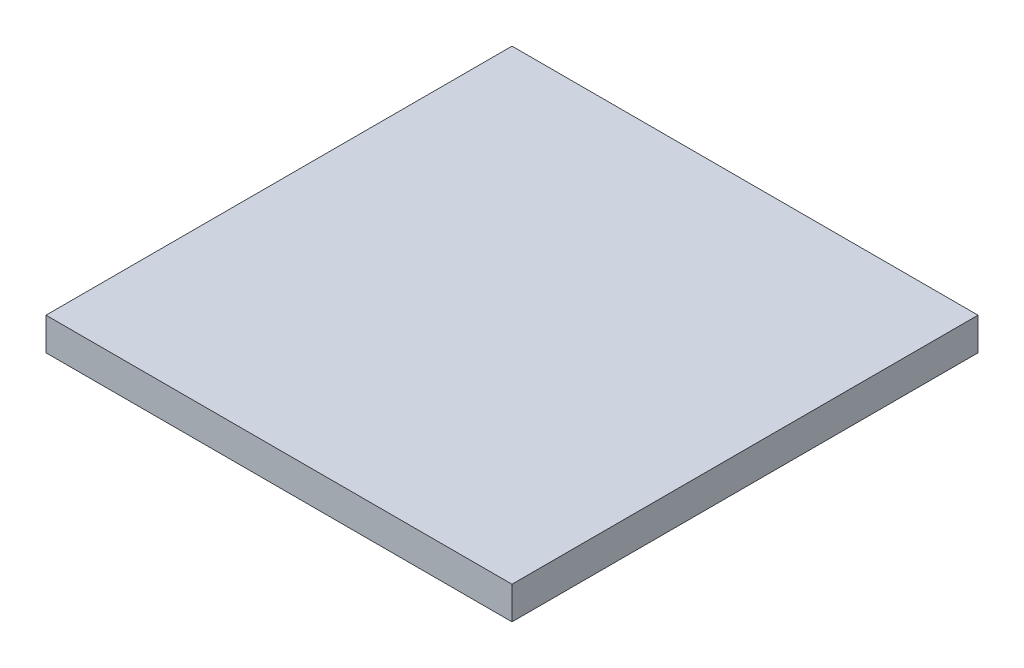
ISO-10303-21;
HEADER;
FILE_DESCRIPTION(('STEP AP214'),'2;1');
FILE_NAME('part.step','',(''),(''),'','','');
FILE_SCHEMA(('AUTOMOTIVE_DESIGN { 1 0 10303 214 1 1 1 1 }'));
ENDSEC;
DATA;
#1=APPLICATION_CONTEXT('core data for automotive mechanical design processes');
#2=APPLICATION_PROTOCOL_DEFINITION('international standard','automotive_design',2000,#1);
#3=PRODUCT_CONTEXT('',#1,'mechanical');
#4=PRODUCT('Part','Part','',(#3));
#5=PRODUCT_RELATED_PRODUCT_CATEGORY('part','',(#4));
#6=PRODUCT_DEFINITION_FORMATION('','',#4);
#7=PRODUCT_DEFINITION_CONTEXT('part definition',#1,'design');
#8=PRODUCT_DEFINITION('design','',#6,#7);
#9=PRODUCT_DEFINITION_SHAPE('','',#8);
#10=(LENGTH_UNIT() NAMED_UNIT(*) SI_UNIT(.MILLI.,.METRE.));
#11=(NAMED_UNIT(*) PLANE_ANGLE_UNIT() SI_UNIT($,.RADIAN.));
#12=(NAMED_UNIT(*) SI_UNIT($,.STERADIAN.) SOLID_ANGLE_UNIT());
#13=UNCERTAINTY_MEASURE_WITH_UNIT(LENGTH_MEASURE(1.E-05),#10,'distance_accuracy_value','');
#14=(GEOMETRIC_REPRESENTATION_CONTEXT(3) GLOBAL_UNCERTAINTY_ASSIGNED_CONTEXT((#13)) GLOBAL_UNIT_ASSIGNED_CONTEXT((#10,
#11,#12)) REPRESENTATION_CONTEXT('',''));
#15=CARTESIAN_POINT('',(0.,0.,0.));
#16=DIRECTION('',(0.,0.,1.));
#17=DIRECTION('',(1.,0.,0.));
#18=AXIS2_PLACEMENT_3D('',#15,#16,#17);
#19=CARTESIAN_POINT('',(4.99999999999998,0.7,5.));
#20=DIRECTION('',(-1.,0.,0.));
#21=DIRECTION('',(0.,0.,1.));
#22=AXIS2_PLACEMENT_3D('',#19,#20,#21);
#23=PLANE('',#22);
#24=DIRECTION('',(0.,0.,-1.));
#25=VECTOR('',#24,1.);
#26=CARTESIAN_POINT('',(4.99999999999998,0.,5.));
#27=LINE('',#26,#25);
#28=CARTESIAN_POINT('',(4.99999999999998,0.,5.));
#29=VERTEX_POINT('',#28);
#30=CARTESIAN_POINT('',(4.99999999999998,0.,-5.));
#31=VERTEX_POINT('',#30);
#32=EDGE_CURVE('E96',#29,#31,#27,.T.);
#33=ORIENTED_EDGE('',*,*,#32,.T.);
#34=DIRECTION('',(0.,-1.,0.));
#35=VECTOR('',#34,1.);
#36=CARTESIAN_POINT('',(4.99999999999998,0.7,-5.));
#37=LINE('',#36,#35);
#38=CARTESIAN_POINT('',(4.99999999999998,0.7,-5.));
#39=VERTEX_POINT('',#38);
#40=EDGE_CURVE('E11',#39,#31,#37,.T.);
#41=ORIENTED_EDGE('',*,*,#40,.F.);
#42=DIRECTION('',(0.,0.,-1.));
#43=VECTOR('',#42,1.);
#44=CARTESIAN_POINT('',(4.99999999999998,0.7,5.));
#45=LINE('',#44,#43);
#46=CARTESIAN_POINT('',(4.99999999999998,0.7,5.));
#47=VERTEX_POINT('',#46);
#48=EDGE_CURVE('E84',#47,#39,#45,.T.);
#49=ORIENTED_EDGE('',*,*,#48,.F.);
#50=DIRECTION('',(0.,-1.,0.));
#51=VECTOR('',#50,1.);
#52=CARTESIAN_POINT('',(4.99999999999998,0.7,5.));
#53=LINE('',#52,#51);
#54=EDGE_CURVE('E92',#47,#29,#53,.T.);
#55=ORIENTED_EDGE('',*,*,#54,.T.);
#56=EDGE_LOOP('',(#33,#41,#49,#55));
#57=FACE_BOUND('',#56,.T.);
#58=ADVANCED_FACE('F33',(#57),#23,.F.);
#59=CARTESIAN_POINT('',(-5.00000000000003,0.7,-5.));
#60=DIRECTION('',(0.,0.,1.));
#61=DIRECTION('',(1.,0.,0.));
#62=AXIS2_PLACEMENT_3D('',#59,#60,#61);
#63=PLANE('',#62);
#64=DIRECTION('',(-1.,0.,0.));
#65=VECTOR('',#64,1.);
#66=CARTESIAN_POINT('',(-5.00000000000003,0.,-5.));
#67=LINE('',#66,#65);
#68=CARTESIAN_POINT('',(-5.00000000000003,0.,-5.));
#69=VERTEX_POINT('',#68);
#70=EDGE_CURVE('E88',#31,#69,#67,.T.);
#71=ORIENTED_EDGE('',*,*,#70,.T.);
#72=DIRECTION('',(0.,-1.,0.));
#73=VECTOR('',#72,1.);
#74=CARTESIAN_POINT('',(-5.00000000000003,0.7,-5.));
#75=LINE('',#74,#73);
#76=CARTESIAN_POINT('',(-5.00000000000003,0.7,-5.));
#77=VERTEX_POINT('',#76);
#78=EDGE_CURVE('E41',#77,#69,#75,.T.);
#79=ORIENTED_EDGE('',*,*,#78,.F.);
#80=DIRECTION('',(-1.,0.,0.));
#81=VECTOR('',#80,1.);
#82=CARTESIAN_POINT('',(-5.00000000000003,0.7,-5.));
#83=LINE('',#82,#81);
#84=EDGE_CURVE('E79',#39,#77,#83,.T.);
#85=ORIENTED_EDGE('',*,*,#84,.F.);
#86=ORIENTED_EDGE('',*,*,#40,.T.);
#87=EDGE_LOOP('',(#71,#79,#85,#86));
#88=FACE_BOUND('',#87,.T.);
#89=ADVANCED_FACE('F87',(#88),#63,.F.);
#90=CARTESIAN_POINT('',(-5.00000000000003,0.7,5.));
#91=DIRECTION('',(1.,0.,0.));
#92=DIRECTION('',(0.,0.,-1.));
#93=AXIS2_PLACEMENT_3D('',#90,#91,#92);
#94=PLANE('',#93);
#95=DIRECTION('',(0.,0.,1.));
#96=VECTOR('',#95,1.);
#97=CARTESIAN_POINT('',(-5.00000000000003,0.,5.));
#98=LINE('',#97,#96);
#99=CARTESIAN_POINT('',(-5.00000000000003,0.,5.));
#100=VERTEX_POINT('',#99);
#101=EDGE_CURVE('E66',#69,#100,#98,.T.);
#102=ORIENTED_EDGE('',*,*,#101,.T.);
#103=DIRECTION('',(0.,-1.,0.));
#104=VECTOR('',#103,1.);
#105=CARTESIAN_POINT('',(-5.00000000000003,0.7,5.));
#106=LINE('',#105,#104);
#107=CARTESIAN_POINT('',(-5.00000000000003,0.7,5.));
#108=VERTEX_POINT('',#107);
#109=EDGE_CURVE('E89',#108,#100,#106,.T.);
#110=ORIENTED_EDGE('',*,*,#109,.F.);
#111=DIRECTION('',(0.,0.,1.));
#112=VECTOR('',#111,1.);
#113=CARTESIAN_POINT('',(-5.00000000000003,0.7,5.));
#114=LINE('',#113,#112);
#115=EDGE_CURVE('E82',#77,#108,#114,.T.);
#116=ORIENTED_EDGE('',*,*,#115,.F.);
#117=ORIENTED_EDGE('',*,*,#78,.T.);
#118=EDGE_LOOP('',(#102,#110,#116,#117));
#119=FACE_BOUND('',#118,.T.);
#120=ADVANCED_FACE('F90',(#119),#94,.F.);
#121=CARTESIAN_POINT('',(-5.00000000000003,0.7,5.));
#122=DIRECTION('',(0.,0.,-1.));
#123=DIRECTION('',(-1.,0.,0.));
#124=AXIS2_PLACEMENT_3D('',#121,#122,#123);
#125=PLANE('',#124);
#126=DIRECTION('',(1.,0.,0.));
#127=VECTOR('',#126,1.);
#128=CARTESIAN_POINT('',(-5.00000000000003,0.,5.));
#129=LINE('',#128,#127);
#130=EDGE_CURVE('E72',#100,#29,#129,.T.);
#131=ORIENTED_EDGE('',*,*,#130,.T.);
#132=ORIENTED_EDGE('',*,*,#54,.F.);
#133=DIRECTION('',(1.,0.,0.));
#134=VECTOR('',#133,1.);
#135=CARTESIAN_POINT('',(-5.00000000000003,0.7,5.));
#136=LINE('',#135,#134);
#137=EDGE_CURVE('E49',#108,#47,#136,.T.);
#138=ORIENTED_EDGE('',*,*,#137,.F.);
#139=ORIENTED_EDGE('',*,*,#109,.T.);
#140=EDGE_LOOP('',(#131,#132,#138,#139));
#141=FACE_BOUND('',#140,.T.);
#142=ADVANCED_FACE('F103',(#141),#125,.F.);
#143=CARTESIAN_POINT('',(0.,0.7,0.));
#144=DIRECTION('',(0.,-1.,0.));
#145=DIRECTION('',(0.,0.,-1.));
#146=AXIS2_PLACEMENT_3D('',#143,#144,#145);
#147=PLANE('',#146);
#148=ORIENTED_EDGE('',*,*,#48,.T.);
#149=ORIENTED_EDGE('',*,*,#84,.T.);
#150=ORIENTED_EDGE('',*,*,#115,.T.);
#151=ORIENTED_EDGE('',*,*,#137,.T.);
#152=EDGE_LOOP('',(#148,#149,#150,#151));
#153=FACE_BOUND('',#152,.T.);
#154=ADVANCED_FACE('F80',(#153),#147,.F.);
#155=CARTESIAN_POINT('',(0.,0.,0.));
#156=DIRECTION('',(0.,-1.,0.));
#157=DIRECTION('',(0.,0.,-1.));
#158=AXIS2_PLACEMENT_3D('',#155,#156,#157);
#159=PLANE('',#158);
#160=ORIENTED_EDGE('',*,*,#32,.F.);
#161=ORIENTED_EDGE('',*,*,#130,.F.);
#162=ORIENTED_EDGE('',*,*,#101,.F.);
#163=ORIENTED_EDGE('',*,*,#70,.F.);
#164=EDGE_LOOP('',(#160,#161,#162,#163));
#165=FACE_BOUND('',#164,.T.);
#166=ADVANCED_FACE('F106',(#165),#159,.T.);
#167=CLOSED_SHELL('',(#58,#89,#120,#142,#154,#166));
#168=MANIFOLD_SOLID_BREP('B2',#167);
#169=ADVANCED_BREP_SHAPE_REPRESENTATION('',(#18,#168),#14);
#170=SHAPE_DEFINITION_REPRESENTATION(#9,#169);
ENDSEC;
END-ISO-10303-21;
